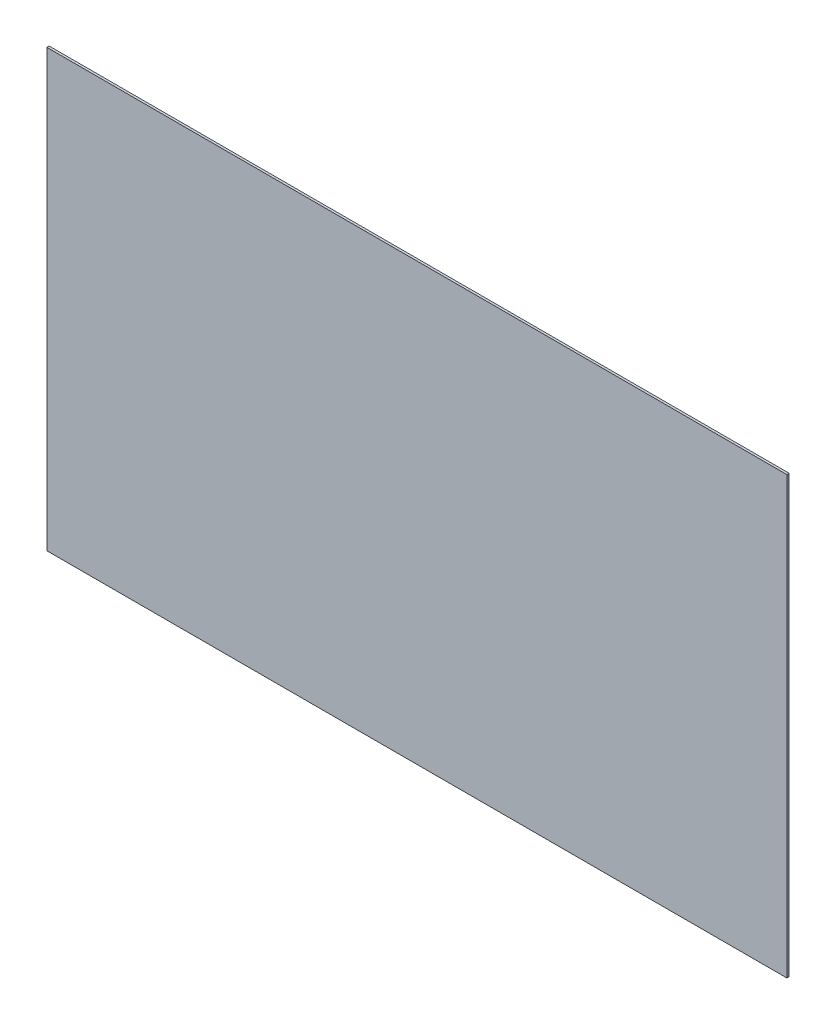
ISO-10303-21;
HEADER;
FILE_DESCRIPTION(('STEP AP214'),'2;1');
FILE_NAME('part.step','',(''),(''),'','','');
FILE_SCHEMA(('AUTOMOTIVE_DESIGN { 1 0 10303 214 1 1 1 1 }'));
ENDSEC;
DATA;
#1=APPLICATION_CONTEXT('core data for automotive mechanical design processes');
#2=APPLICATION_PROTOCOL_DEFINITION('international standard','automotive_design',2000,#1);
#3=PRODUCT_CONTEXT('',#1,'mechanical');
#4=PRODUCT('Part','Part','',(#3));
#5=PRODUCT_RELATED_PRODUCT_CATEGORY('part','',(#4));
#6=PRODUCT_DEFINITION_FORMATION('','',#4);
#7=PRODUCT_DEFINITION_CONTEXT('part definition',#1,'design');
#8=PRODUCT_DEFINITION('design','',#6,#7);
#9=PRODUCT_DEFINITION_SHAPE('','',#8);
#10=(LENGTH_UNIT() NAMED_UNIT(*) SI_UNIT(.MILLI.,.METRE.));
#11=(NAMED_UNIT(*) PLANE_ANGLE_UNIT() SI_UNIT($,.RADIAN.));
#12=(NAMED_UNIT(*) SI_UNIT($,.STERADIAN.) SOLID_ANGLE_UNIT());
#13=UNCERTAINTY_MEASURE_WITH_UNIT(LENGTH_MEASURE(1.E-05),#10,'distance_accuracy_value','');
#14=(GEOMETRIC_REPRESENTATION_CONTEXT(3) GLOBAL_UNCERTAINTY_ASSIGNED_CONTEXT((#13)) GLOBAL_UNIT_ASSIGNED_CONTEXT((#10,
#11,#12)) REPRESENTATION_CONTEXT('',''));
#15=CARTESIAN_POINT('',(0.,0.,0.));
#16=DIRECTION('',(0.,0.,1.));
#17=DIRECTION('',(1.,0.,0.));
#18=AXIS2_PLACEMENT_3D('',#15,#16,#17);
#19=CARTESIAN_POINT('',(32.25,-19.,0.2));
#20=DIRECTION('',(-1.,0.,0.));
#21=DIRECTION('',(0.,0.,1.));
#22=AXIS2_PLACEMENT_3D('',#19,#20,#21);
#23=PLANE('',#22);
#24=DIRECTION('',(0.,1.,0.));
#25=VECTOR('',#24,1.);
#26=CARTESIAN_POINT('',(32.25,-19.,0.));
#27=LINE('',#26,#25);
#28=CARTESIAN_POINT('',(32.25,-19.,0.));
#29=VERTEX_POINT('',#28);
#30=CARTESIAN_POINT('',(32.25,19.,0.));
#31=VERTEX_POINT('',#30);
#32=EDGE_CURVE('E79',#29,#31,#27,.T.);
#33=ORIENTED_EDGE('',*,*,#32,.T.);
#34=DIRECTION('',(0.,0.,-1.));
#35=VECTOR('',#34,1.);
#36=CARTESIAN_POINT('',(32.25,19.,0.2));
#37=LINE('',#36,#35);
#38=CARTESIAN_POINT('',(32.25,19.,0.2));
#39=VERTEX_POINT('',#38);
#40=EDGE_CURVE('E11',#39,#31,#37,.T.);
#41=ORIENTED_EDGE('',*,*,#40,.F.);
#42=DIRECTION('',(0.,1.,0.));
#43=VECTOR('',#42,1.);
#44=CARTESIAN_POINT('',(32.25,-19.,0.2));
#45=LINE('',#44,#43);
#46=CARTESIAN_POINT('',(32.25,-19.,0.2));
#47=VERTEX_POINT('',#46);
#48=EDGE_CURVE('E68',#47,#39,#45,.T.);
#49=ORIENTED_EDGE('',*,*,#48,.F.);
#50=DIRECTION('',(0.,0.,-1.));
#51=VECTOR('',#50,1.);
#52=CARTESIAN_POINT('',(32.25,-19.,0.2));
#53=LINE('',#52,#51);
#54=EDGE_CURVE('E76',#47,#29,#53,.T.);
#55=ORIENTED_EDGE('',*,*,#54,.T.);
#56=EDGE_LOOP('',(#33,#41,#49,#55));
#57=FACE_BOUND('',#56,.T.);
#58=ADVANCED_FACE('F17',(#57),#23,.F.);
#59=CARTESIAN_POINT('',(-32.25,19.,0.2));
#60=DIRECTION('',(0.,-1.,0.));
#61=DIRECTION('',(0.,0.,-1.));
#62=AXIS2_PLACEMENT_3D('',#59,#60,#61);
#63=PLANE('',#62);
#64=DIRECTION('',(-1.,0.,0.));
#65=VECTOR('',#64,1.);
#66=CARTESIAN_POINT('',(-32.25,19.,0.));
#67=LINE('',#66,#65);
#68=CARTESIAN_POINT('',(-32.25,19.,0.));
#69=VERTEX_POINT('',#68);
#70=EDGE_CURVE('E71',#31,#69,#67,.T.);
#71=ORIENTED_EDGE('',*,*,#70,.T.);
#72=DIRECTION('',(0.,0.,-1.));
#73=VECTOR('',#72,1.);
#74=CARTESIAN_POINT('',(-32.25,19.,0.2));
#75=LINE('',#74,#73);
#76=CARTESIAN_POINT('',(-32.25,19.,0.2));
#77=VERTEX_POINT('',#76);
#78=EDGE_CURVE('E25',#77,#69,#75,.T.);
#79=ORIENTED_EDGE('',*,*,#78,.F.);
#80=DIRECTION('',(-1.,0.,0.));
#81=VECTOR('',#80,1.);
#82=CARTESIAN_POINT('',(-32.25,19.,0.2));
#83=LINE('',#82,#81);
#84=EDGE_CURVE('E64',#39,#77,#83,.T.);
#85=ORIENTED_EDGE('',*,*,#84,.F.);
#86=ORIENTED_EDGE('',*,*,#40,.T.);
#87=EDGE_LOOP('',(#71,#79,#85,#86));
#88=FACE_BOUND('',#87,.T.);
#89=ADVANCED_FACE('F75',(#88),#63,.F.);
#90=CARTESIAN_POINT('',(-32.25,-19.,0.2));
#91=DIRECTION('',(1.,0.,0.));
#92=DIRECTION('',(0.,0.,-1.));
#93=AXIS2_PLACEMENT_3D('',#90,#91,#92);
#94=PLANE('',#93);
#95=DIRECTION('',(0.,-1.,0.));
#96=VECTOR('',#95,1.);
#97=CARTESIAN_POINT('',(-32.25,-19.,0.));
#98=LINE('',#97,#96);
#99=CARTESIAN_POINT('',(-32.25,-19.,0.));
#100=VERTEX_POINT('',#99);
#101=EDGE_CURVE('E49',#69,#100,#98,.T.);
#102=ORIENTED_EDGE('',*,*,#101,.T.);
#103=DIRECTION('',(0.,0.,-1.));
#104=VECTOR('',#103,1.);
#105=CARTESIAN_POINT('',(-32.25,-19.,0.2));
#106=LINE('',#105,#104);
#107=CARTESIAN_POINT('',(-32.25,-19.,0.2));
#108=VERTEX_POINT('',#107);
#109=EDGE_CURVE('E73',#108,#100,#106,.T.);
#110=ORIENTED_EDGE('',*,*,#109,.F.);
#111=DIRECTION('',(0.,-1.,0.));
#112=VECTOR('',#111,1.);
#113=CARTESIAN_POINT('',(-32.25,-19.,0.2));
#114=LINE('',#113,#112);
#115=EDGE_CURVE('E66',#77,#108,#114,.T.);
#116=ORIENTED_EDGE('',*,*,#115,.F.);
#117=ORIENTED_EDGE('',*,*,#78,.T.);
#118=EDGE_LOOP('',(#102,#110,#116,#117));
#119=FACE_BOUND('',#118,.T.);
#120=ADVANCED_FACE('F72',(#119),#94,.F.);
#121=CARTESIAN_POINT('',(-32.25,-19.,0.2));
#122=DIRECTION('',(0.,1.,0.));
#123=DIRECTION('',(0.,0.,1.));
#124=AXIS2_PLACEMENT_3D('',#121,#122,#123);
#125=PLANE('',#124);
#126=DIRECTION('',(1.,0.,0.));
#127=VECTOR('',#126,1.);
#128=CARTESIAN_POINT('',(-32.25,-19.,0.));
#129=LINE('',#128,#127);
#130=EDGE_CURVE('E57',#100,#29,#129,.T.);
#131=ORIENTED_EDGE('',*,*,#130,.T.);
#132=ORIENTED_EDGE('',*,*,#54,.F.);
#133=DIRECTION('',(1.,0.,0.));
#134=VECTOR('',#133,1.);
#135=CARTESIAN_POINT('',(-32.25,-19.,0.2));
#136=LINE('',#135,#134);
#137=EDGE_CURVE('E31',#108,#47,#136,.T.);
#138=ORIENTED_EDGE('',*,*,#137,.F.);
#139=ORIENTED_EDGE('',*,*,#109,.T.);
#140=EDGE_LOOP('',(#131,#132,#138,#139));
#141=FACE_BOUND('',#140,.T.);
#142=ADVANCED_FACE('F87',(#141),#125,.F.);
#143=CARTESIAN_POINT('',(0.,0.,0.2));
#144=DIRECTION('',(0.,0.,-1.));
#145=DIRECTION('',(-1.,0.,0.));
#146=AXIS2_PLACEMENT_3D('',#143,#144,#145);
#147=PLANE('',#146);
#148=ORIENTED_EDGE('',*,*,#48,.T.);
#149=ORIENTED_EDGE('',*,*,#84,.T.);
#150=ORIENTED_EDGE('',*,*,#115,.T.);
#151=ORIENTED_EDGE('',*,*,#137,.T.);
#152=EDGE_LOOP('',(#148,#149,#150,#151));
#153=FACE_BOUND('',#152,.T.);
#154=ADVANCED_FACE('F63',(#153),#147,.F.);
#155=CARTESIAN_POINT('',(0.,0.,0.));
#156=DIRECTION('',(0.,0.,-1.));
#157=DIRECTION('',(-1.,0.,0.));
#158=AXIS2_PLACEMENT_3D('',#155,#156,#157);
#159=PLANE('',#158);
#160=ORIENTED_EDGE('',*,*,#32,.F.);
#161=ORIENTED_EDGE('',*,*,#130,.F.);
#162=ORIENTED_EDGE('',*,*,#101,.F.);
#163=ORIENTED_EDGE('',*,*,#70,.F.);
#164=EDGE_LOOP('',(#160,#161,#162,#163));
#165=FACE_BOUND('',#164,.T.);
#166=ADVANCED_FACE('F89',(#165),#159,.T.);
#167=CLOSED_SHELL('',(#58,#89,#120,#142,#154,#166));
#168=MANIFOLD_SOLID_BREP('B1',#167);
#169=ADVANCED_BREP_SHAPE_REPRESENTATION('',(#18,#168),#14);
#170=SHAPE_DEFINITION_REPRESENTATION(#9,#169);
ENDSEC;
END-ISO-10303-21;
